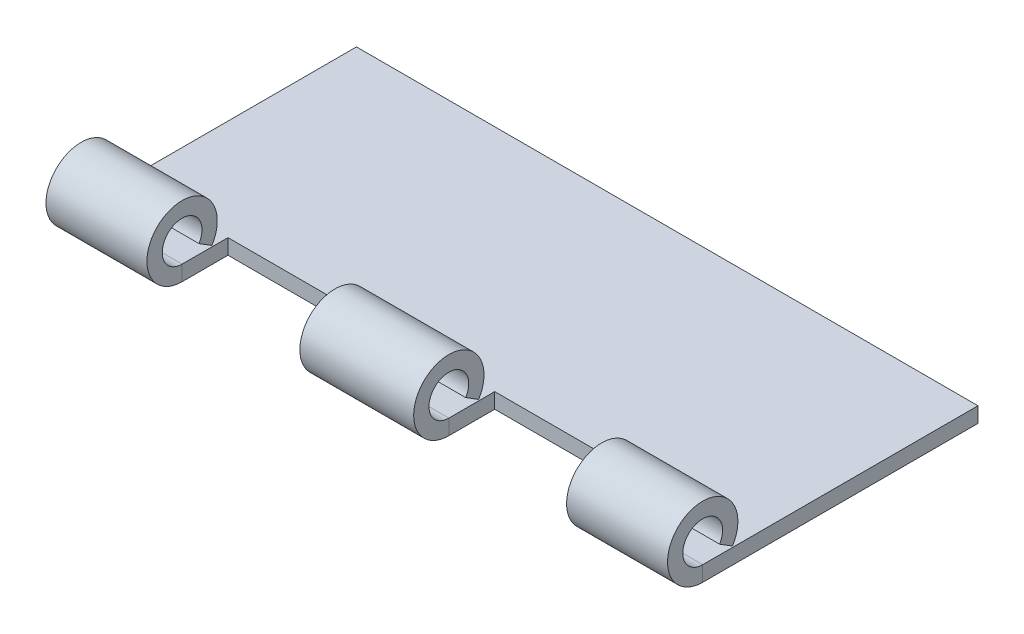
ISO-10303-21;
HEADER;
FILE_DESCRIPTION(('STEP AP214'),'2;1');
FILE_NAME('part.step','',(''),(''),'','','');
FILE_SCHEMA(('AUTOMOTIVE_DESIGN { 1 0 10303 214 1 1 1 1 }'));
ENDSEC;
DATA;
#1=APPLICATION_CONTEXT('core data for automotive mechanical design processes');
#2=APPLICATION_PROTOCOL_DEFINITION('international standard','automotive_design',2000,#1);
#3=PRODUCT_CONTEXT('',#1,'mechanical');
#4=PRODUCT('Part','Part','',(#3));
#5=PRODUCT_RELATED_PRODUCT_CATEGORY('part','',(#4));
#6=PRODUCT_DEFINITION_FORMATION('','',#4);
#7=PRODUCT_DEFINITION_CONTEXT('part definition',#1,'design');
#8=PRODUCT_DEFINITION('design','',#6,#7);
#9=PRODUCT_DEFINITION_SHAPE('','',#8);
#10=(LENGTH_UNIT() NAMED_UNIT(*) SI_UNIT(.MILLI.,.METRE.));
#11=(NAMED_UNIT(*) PLANE_ANGLE_UNIT() SI_UNIT($,.RADIAN.));
#12=(NAMED_UNIT(*) SI_UNIT($,.STERADIAN.) SOLID_ANGLE_UNIT());
#13=UNCERTAINTY_MEASURE_WITH_UNIT(LENGTH_MEASURE(1.E-05),#10,'distance_accuracy_value','');
#14=(GEOMETRIC_REPRESENTATION_CONTEXT(3) GLOBAL_UNCERTAINTY_ASSIGNED_CONTEXT((#13)) GLOBAL_UNIT_ASSIGNED_CONTEXT((#10,
#11,#12)) REPRESENTATION_CONTEXT('',''));
#15=CARTESIAN_POINT('',(0.,0.,0.));
#16=DIRECTION('',(0.,0.,1.));
#17=DIRECTION('',(1.,0.,0.));
#18=AXIS2_PLACEMENT_3D('',#15,#16,#17);
#19=CARTESIAN_POINT('',(9.3,-5.75,51.2750552451707));
#20=DIRECTION('',(-1.,0.,0.));
#21=DIRECTION('',(0.,0.,1.));
#22=AXIS2_PLACEMENT_3D('',#19,#20,#21);
#23=PLANE('',#22);
#24=DIRECTION('',(0.,0.,1.));
#25=VECTOR('',#24,1.);
#26=CARTESIAN_POINT('',(9.29999999999997,-3.24999999999999,-45.));
#27=LINE('',#26,#25);
#28=CARTESIAN_POINT('',(9.29999999999998,-3.25,-7.5));
#29=VERTEX_POINT('',#28);
#30=CARTESIAN_POINT('',(9.29999999999998,-3.25,0.));
#31=VERTEX_POINT('',#30);
#32=EDGE_CURVE('E377',#29,#31,#27,.T.);
#33=ORIENTED_EDGE('',*,*,#32,.T.);
#34=DIRECTION('',(0.,-1.,0.));
#35=VECTOR('',#34,1.);
#36=CARTESIAN_POINT('',(9.29999999999998,-3.25,0.));
#37=LINE('',#36,#35);
#38=CARTESIAN_POINT('',(9.29999999999998,-5.75,0.));
#39=VERTEX_POINT('',#38);
#40=EDGE_CURVE('E12',#31,#39,#37,.T.);
#41=ORIENTED_EDGE('',*,*,#40,.T.);
#42=DIRECTION('',(0.,0.,1.));
#43=VECTOR('',#42,1.);
#44=CARTESIAN_POINT('',(9.3,-5.75,51.2750552451707));
#45=LINE('',#44,#43);
#46=CARTESIAN_POINT('',(9.29999999999998,-5.75,-7.5));
#47=VERTEX_POINT('',#46);
#48=EDGE_CURVE('E361',#47,#39,#45,.T.);
#49=ORIENTED_EDGE('',*,*,#48,.F.);
#50=DIRECTION('',(0.,1.,0.));
#51=VECTOR('',#50,1.);
#52=CARTESIAN_POINT('',(9.29999999999998,-5.75,-7.5));
#53=LINE('',#52,#51);
#54=EDGE_CURVE('E360',#47,#29,#53,.T.);
#55=ORIENTED_EDGE('',*,*,#54,.T.);
#56=EDGE_LOOP('',(#33,#41,#49,#55));
#57=FACE_BOUND('',#56,.T.);
#58=ADVANCED_FACE('F42',(#57),#23,.F.);
#59=CARTESIAN_POINT('',(34.3,-5.75,51.2750552451707));
#60=DIRECTION('',(1.,0.,0.));
#61=DIRECTION('',(0.,0.,-1.));
#62=AXIS2_PLACEMENT_3D('',#59,#60,#61);
#63=PLANE('',#62);
#64=DIRECTION('',(0.,0.,-1.));
#65=VECTOR('',#64,1.);
#66=CARTESIAN_POINT('',(34.3,-5.75,51.2750552451707));
#67=LINE('',#66,#65);
#68=CARTESIAN_POINT('',(34.3,-5.75,0.));
#69=VERTEX_POINT('',#68);
#70=CARTESIAN_POINT('',(34.3,-5.75,-7.50000000000001));
#71=VERTEX_POINT('',#70);
#72=EDGE_CURVE('E211',#69,#71,#67,.T.);
#73=ORIENTED_EDGE('',*,*,#72,.F.);
#74=DIRECTION('',(0.,1.,0.));
#75=VECTOR('',#74,1.);
#76=CARTESIAN_POINT('',(34.3,-5.75,0.));
#77=LINE('',#76,#75);
#78=CARTESIAN_POINT('',(34.3,-3.25,0.));
#79=VERTEX_POINT('',#78);
#80=EDGE_CURVE('E51',#69,#79,#77,.T.);
#81=ORIENTED_EDGE('',*,*,#80,.T.);
#82=DIRECTION('',(0.,0.,-1.));
#83=VECTOR('',#82,1.);
#84=CARTESIAN_POINT('',(34.3,-3.24999999999999,-45.));
#85=LINE('',#84,#83);
#86=CARTESIAN_POINT('',(34.3,-3.25,-7.50000000000001));
#87=VERTEX_POINT('',#86);
#88=EDGE_CURVE('E207',#79,#87,#85,.T.);
#89=ORIENTED_EDGE('',*,*,#88,.T.);
#90=DIRECTION('',(0.,1.,0.));
#91=VECTOR('',#90,1.);
#92=CARTESIAN_POINT('',(34.3,-5.75,-7.50000000000001));
#93=LINE('',#92,#91);
#94=EDGE_CURVE('E357',#71,#87,#93,.T.);
#95=ORIENTED_EDGE('',*,*,#94,.F.);
#96=EDGE_LOOP('',(#73,#81,#89,#95));
#97=FACE_BOUND('',#96,.T.);
#98=ADVANCED_FACE('F203',(#97),#63,.F.);
#99=CARTESIAN_POINT('',(-34.3,-5.75,51.2750552451707));
#100=DIRECTION('',(-1.,0.,0.));
#101=DIRECTION('',(0.,0.,1.));
#102=AXIS2_PLACEMENT_3D('',#99,#100,#101);
#103=PLANE('',#102);
#104=DIRECTION('',(0.,0.,1.));
#105=VECTOR('',#104,1.);
#106=CARTESIAN_POINT('',(-34.3,-3.24999999999999,-45.));
#107=LINE('',#106,#105);
#108=CARTESIAN_POINT('',(-34.3,-3.25,-7.5));
#109=VERTEX_POINT('',#108);
#110=CARTESIAN_POINT('',(-34.3,-3.25,0.));
#111=VERTEX_POINT('',#110);
#112=EDGE_CURVE('E248',#109,#111,#107,.T.);
#113=ORIENTED_EDGE('',*,*,#112,.T.);
#114=DIRECTION('',(0.,-1.,0.));
#115=VECTOR('',#114,1.);
#116=CARTESIAN_POINT('',(-34.3,-3.25,0.));
#117=LINE('',#116,#115);
#118=CARTESIAN_POINT('',(-34.3,-5.75,0.));
#119=VERTEX_POINT('',#118);
#120=EDGE_CURVE('E195',#111,#119,#117,.T.);
#121=ORIENTED_EDGE('',*,*,#120,.T.);
#122=DIRECTION('',(0.,0.,1.));
#123=VECTOR('',#122,1.);
#124=CARTESIAN_POINT('',(-34.3,-5.75,51.2750552451707));
#125=LINE('',#124,#123);
#126=CARTESIAN_POINT('',(-34.3,-5.75,-7.5));
#127=VERTEX_POINT('',#126);
#128=EDGE_CURVE('E234',#127,#119,#125,.T.);
#129=ORIENTED_EDGE('',*,*,#128,.F.);
#130=DIRECTION('',(0.,1.,0.));
#131=VECTOR('',#130,1.);
#132=CARTESIAN_POINT('',(-34.3,-5.75,-7.5));
#133=LINE('',#132,#131);
#134=EDGE_CURVE('E237',#127,#109,#133,.T.);
#135=ORIENTED_EDGE('',*,*,#134,.T.);
#136=EDGE_LOOP('',(#113,#121,#129,#135));
#137=FACE_BOUND('',#136,.T.);
#138=ADVANCED_FACE('F410',(#137),#103,.F.);
#139=CARTESIAN_POINT('',(-9.29999999999998,-5.75,51.2750552451707));
#140=DIRECTION('',(1.,0.,0.));
#141=DIRECTION('',(0.,0.,-1.));
#142=AXIS2_PLACEMENT_3D('',#139,#140,#141);
#143=PLANE('',#142);
#144=DIRECTION('',(0.,0.,-1.));
#145=VECTOR('',#144,1.);
#146=CARTESIAN_POINT('',(-9.29999999999998,-5.75,51.2750552451707));
#147=LINE('',#146,#145);
#148=CARTESIAN_POINT('',(-9.29999999999998,-5.75,0.));
#149=VERTEX_POINT('',#148);
#150=CARTESIAN_POINT('',(-9.29999999999998,-5.75,-7.5));
#151=VERTEX_POINT('',#150);
#152=EDGE_CURVE('E225',#149,#151,#147,.T.);
#153=ORIENTED_EDGE('',*,*,#152,.F.);
#154=DIRECTION('',(0.,1.,0.));
#155=VECTOR('',#154,1.);
#156=CARTESIAN_POINT('',(-9.29999999999998,-5.75,0.));
#157=LINE('',#156,#155);
#158=CARTESIAN_POINT('',(-9.29999999999998,-3.25,0.));
#159=VERTEX_POINT('',#158);
#160=EDGE_CURVE('E192',#149,#159,#157,.T.);
#161=ORIENTED_EDGE('',*,*,#160,.T.);
#162=DIRECTION('',(0.,0.,-1.));
#163=VECTOR('',#162,1.);
#164=CARTESIAN_POINT('',(-9.29999999999998,-3.24999999999999,-45.));
#165=LINE('',#164,#163);
#166=CARTESIAN_POINT('',(-9.29999999999998,-3.25,-7.5));
#167=VERTEX_POINT('',#166);
#168=EDGE_CURVE('E144',#159,#167,#165,.T.);
#169=ORIENTED_EDGE('',*,*,#168,.T.);
#170=DIRECTION('',(0.,1.,0.));
#171=VECTOR('',#170,1.);
#172=CARTESIAN_POINT('',(-9.29999999999998,-5.75,-7.5));
#173=LINE('',#172,#171);
#174=EDGE_CURVE('E236',#151,#167,#173,.T.);
#175=ORIENTED_EDGE('',*,*,#174,.F.);
#176=EDGE_LOOP('',(#153,#161,#169,#175));
#177=FACE_BOUND('',#176,.T.);
#178=ADVANCED_FACE('F306',(#177),#143,.F.);
#179=CARTESIAN_POINT('',(50.8,0.,0.));
#180=DIRECTION('',(-1.,0.,0.));
#181=DIRECTION('',(0.,0.,1.));
#182=AXIS2_PLACEMENT_3D('',#179,#180,#181);
#183=CYLINDRICAL_SURFACE('',#182,3.25);
#184=CARTESIAN_POINT('',(34.3,0.,0.));
#185=DIRECTION('',(1.,0.,0.));
#186=DIRECTION('',(0.,0.,-1.));
#187=AXIS2_PLACEMENT_3D('',#184,#185,#186);
#188=CIRCLE('',#187,3.25);
#189=CARTESIAN_POINT('',(34.3,-1.72391304347826,-2.7551086763548));
#190=VERTEX_POINT('',#189);
#191=EDGE_CURVE('E118',#190,#79,#188,.T.);
#192=ORIENTED_EDGE('',*,*,#191,.F.);
#193=DIRECTION('',(-1.,0.,0.));
#194=VECTOR('',#193,1.);
#195=CARTESIAN_POINT('',(50.8,-1.72391304347826,-2.7551086763548));
#196=LINE('',#195,#194);
#197=CARTESIAN_POINT('',(50.8,-1.72391304347826,-2.7551086763548));
#198=VERTEX_POINT('',#197);
#199=EDGE_CURVE('E111',#198,#190,#196,.T.);
#200=ORIENTED_EDGE('',*,*,#199,.F.);
#201=CARTESIAN_POINT('',(50.8,0.,0.));
#202=DIRECTION('',(1.,0.,0.));
#203=DIRECTION('',(0.,0.,-1.));
#204=AXIS2_PLACEMENT_3D('',#201,#202,#203);
#205=CIRCLE('',#204,3.25);
#206=CARTESIAN_POINT('',(50.8,-3.25,0.));
#207=VERTEX_POINT('',#206);
#208=EDGE_CURVE('E115',#198,#207,#205,.T.);
#209=ORIENTED_EDGE('',*,*,#208,.T.);
#210=DIRECTION('',(-1.,0.,0.));
#211=VECTOR('',#210,1.);
#212=CARTESIAN_POINT('',(50.8,-3.25,0.));
#213=LINE('',#212,#211);
#214=EDGE_CURVE('E164',#207,#79,#213,.T.);
#215=ORIENTED_EDGE('',*,*,#214,.T.);
#216=EDGE_LOOP('',(#192,#200,#209,#215));
#217=FACE_BOUND('',#216,.T.);
#218=ADVANCED_FACE('F113',(#217),#183,.F.);
#219=CARTESIAN_POINT('',(50.8,-3.05,-4.87442304278158));
#220=DIRECTION('',(0.,-0.847725746570709,0.530434782608696));
#221=DIRECTION('',(0.,-0.530434782608696,-0.847725746570709));
#222=AXIS2_PLACEMENT_3D('',#219,#220,#221);
#223=PLANE('',#222);
#224=DIRECTION('',(0.,0.530434782608696,0.847725746570709));
#225=VECTOR('',#224,1.);
#226=CARTESIAN_POINT('',(34.3,-3.05,-4.87442304278158));
#227=LINE('',#226,#225);
#228=CARTESIAN_POINT('',(34.3,-3.05,-4.87442304278158));
#229=VERTEX_POINT('',#228);
#230=EDGE_CURVE('E218',#229,#190,#227,.T.);
#231=ORIENTED_EDGE('',*,*,#230,.F.);
#232=DIRECTION('',(-1.,0.,0.));
#233=VECTOR('',#232,1.);
#234=CARTESIAN_POINT('',(50.8,-3.05,-4.87442304278158));
#235=LINE('',#234,#233);
#236=CARTESIAN_POINT('',(50.8,-3.05,-4.87442304278158));
#237=VERTEX_POINT('',#236);
#238=EDGE_CURVE('E134',#237,#229,#235,.T.);
#239=ORIENTED_EDGE('',*,*,#238,.F.);
#240=DIRECTION('',(0.,0.530434782608696,0.847725746570709));
#241=VECTOR('',#240,1.);
#242=CARTESIAN_POINT('',(50.8,-3.05,-4.87442304278158));
#243=LINE('',#242,#241);
#244=EDGE_CURVE('E128',#237,#198,#243,.T.);
#245=ORIENTED_EDGE('',*,*,#244,.T.);
#246=ORIENTED_EDGE('',*,*,#199,.T.);
#247=EDGE_LOOP('',(#231,#239,#245,#246));
#248=FACE_BOUND('',#247,.T.);
#249=ADVANCED_FACE('F132',(#248),#223,.T.);
#250=CARTESIAN_POINT('',(50.8,0.,0.));
#251=DIRECTION('',(-1.,0.,0.));
#252=DIRECTION('',(0.,0.,1.));
#253=AXIS2_PLACEMENT_3D('',#250,#251,#252);
#254=CYLINDRICAL_SURFACE('',#253,5.75);
#255=DIRECTION('',(-1.,0.,0.));
#256=VECTOR('',#255,1.);
#257=CARTESIAN_POINT('',(50.8,-5.75,0.));
#258=LINE('',#257,#256);
#259=EDGE_CURVE('E161',#39,#149,#258,.T.);
#260=ORIENTED_EDGE('',*,*,#259,.F.);
#261=CARTESIAN_POINT('',(9.29999999999998,0.,0.));
#262=DIRECTION('',(-1.,0.,0.));
#263=DIRECTION('',(0.,0.,1.));
#264=AXIS2_PLACEMENT_3D('',#261,#262,#263);
#265=CIRCLE('',#264,5.75);
#266=CARTESIAN_POINT('',(9.29999999999998,-3.05,-4.87442304278158));
#267=VERTEX_POINT('',#266);
#268=EDGE_CURVE('E183',#39,#267,#265,.T.);
#269=ORIENTED_EDGE('',*,*,#268,.T.);
#270=CARTESIAN_POINT('',(-9.29999999999998,-3.05,-4.87442304278158));
#271=VERTEX_POINT('',#270);
#272=EDGE_CURVE('E162',#267,#271,#235,.T.);
#273=ORIENTED_EDGE('',*,*,#272,.T.);
#274=CARTESIAN_POINT('',(-9.29999999999998,0.,0.));
#275=DIRECTION('',(1.,0.,0.));
#276=DIRECTION('',(0.,0.,-1.));
#277=AXIS2_PLACEMENT_3D('',#274,#275,#276);
#278=CIRCLE('',#277,5.75);
#279=EDGE_CURVE('E177',#271,#149,#278,.T.);
#280=ORIENTED_EDGE('',*,*,#279,.T.);
#281=EDGE_LOOP('',(#260,#269,#273,#280));
#282=FACE_BOUND('',#281,.T.);
#283=ADVANCED_FACE('F324',(#282),#254,.T.);
#284=CARTESIAN_POINT('',(9.29999999999998,0.,0.));
#285=DIRECTION('',(-1.,0.,0.));
#286=DIRECTION('',(0.,0.,1.));
#287=AXIS2_PLACEMENT_3D('',#284,#285,#286);
#288=CIRCLE('',#287,3.25);
#289=CARTESIAN_POINT('',(9.29999999999998,-1.72391304347826,-2.7551086763548));
#290=VERTEX_POINT('',#289);
#291=EDGE_CURVE('E292',#31,#290,#288,.T.);
#292=ORIENTED_EDGE('',*,*,#291,.F.);
#293=EDGE_CURVE('E167',#31,#159,#213,.T.);
#294=ORIENTED_EDGE('',*,*,#293,.T.);
#295=CARTESIAN_POINT('',(-9.29999999999998,0.,0.));
#296=DIRECTION('',(1.,0.,0.));
#297=DIRECTION('',(0.,0.,-1.));
#298=AXIS2_PLACEMENT_3D('',#295,#296,#297);
#299=CIRCLE('',#298,3.25);
#300=CARTESIAN_POINT('',(-9.29999999999998,-1.72391304347826,-2.7551086763548));
#301=VERTEX_POINT('',#300);
#302=EDGE_CURVE('E254',#301,#159,#299,.T.);
#303=ORIENTED_EDGE('',*,*,#302,.F.);
#304=EDGE_CURVE('E123',#290,#301,#196,.T.);
#305=ORIENTED_EDGE('',*,*,#304,.F.);
#306=EDGE_LOOP('',(#292,#294,#303,#305));
#307=FACE_BOUND('',#306,.T.);
#308=ADVANCED_FACE('F287',(#307),#183,.F.);
#309=DIRECTION('',(0.,-0.530434782608696,-0.847725746570709));
#310=VECTOR('',#309,1.);
#311=CARTESIAN_POINT('',(9.29999999999998,-3.04999999999999,-4.87442304278157));
#312=LINE('',#311,#310);
#313=EDGE_CURVE('E373',#290,#267,#312,.T.);
#314=ORIENTED_EDGE('',*,*,#313,.F.);
#315=ORIENTED_EDGE('',*,*,#304,.T.);
#316=DIRECTION('',(0.,0.530434782608696,0.847725746570709));
#317=VECTOR('',#316,1.);
#318=CARTESIAN_POINT('',(-9.29999999999998,-3.05,-4.87442304278158));
#319=LINE('',#318,#317);
#320=EDGE_CURVE('E251',#271,#301,#319,.T.);
#321=ORIENTED_EDGE('',*,*,#320,.F.);
#322=ORIENTED_EDGE('',*,*,#272,.F.);
#323=EDGE_LOOP('',(#314,#315,#321,#322));
#324=FACE_BOUND('',#323,.T.);
#325=ADVANCED_FACE('F385',(#324),#223,.T.);
#326=CARTESIAN_POINT('',(-50.8,-5.75,0.));
#327=VERTEX_POINT('',#326);
#328=EDGE_CURVE('E92',#119,#327,#258,.T.);
#329=ORIENTED_EDGE('',*,*,#328,.F.);
#330=CARTESIAN_POINT('',(-34.3,0.,0.));
#331=DIRECTION('',(-1.,0.,0.));
#332=DIRECTION('',(0.,0.,1.));
#333=AXIS2_PLACEMENT_3D('',#330,#331,#332);
#334=CIRCLE('',#333,5.75);
#335=CARTESIAN_POINT('',(-34.3,-3.05,-4.87442304278158));
#336=VERTEX_POINT('',#335);
#337=EDGE_CURVE('E175',#119,#336,#334,.T.);
#338=ORIENTED_EDGE('',*,*,#337,.T.);
#339=CARTESIAN_POINT('',(-50.8,-3.05,-4.87442304278158));
#340=VERTEX_POINT('',#339);
#341=EDGE_CURVE('E84',#336,#340,#235,.T.);
#342=ORIENTED_EDGE('',*,*,#341,.T.);
#343=CARTESIAN_POINT('',(-50.8,0.,0.));
#344=DIRECTION('',(1.,0.,0.));
#345=DIRECTION('',(0.,0.,-1.));
#346=AXIS2_PLACEMENT_3D('',#343,#344,#345);
#347=CIRCLE('',#346,5.75);
#348=EDGE_CURVE('E156',#340,#327,#347,.T.);
#349=ORIENTED_EDGE('',*,*,#348,.T.);
#350=EDGE_LOOP('',(#329,#338,#342,#349));
#351=FACE_BOUND('',#350,.T.);
#352=ADVANCED_FACE('F392',(#351),#254,.T.);
#353=CARTESIAN_POINT('',(50.8,-3.25,0.));
#354=DIRECTION('',(1.,0.,0.));
#355=DIRECTION('',(0.,0.,-1.));
#356=AXIS2_PLACEMENT_3D('',#353,#354,#355);
#357=PLANE('',#356);
#358=DIRECTION('',(0.,-1.,0.));
#359=VECTOR('',#358,1.);
#360=CARTESIAN_POINT('',(50.8,-3.25,0.));
#361=LINE('',#360,#359);
#362=CARTESIAN_POINT('',(50.8,-5.75,0.));
#363=VERTEX_POINT('',#362);
#364=EDGE_CURVE('E59',#207,#363,#361,.T.);
#365=ORIENTED_EDGE('',*,*,#364,.F.);
#366=ORIENTED_EDGE('',*,*,#208,.F.);
#367=ORIENTED_EDGE('',*,*,#244,.F.);
#368=CARTESIAN_POINT('',(50.8,0.,0.));
#369=DIRECTION('',(1.,0.,0.));
#370=DIRECTION('',(0.,0.,-1.));
#371=AXIS2_PLACEMENT_3D('',#368,#369,#370);
#372=CIRCLE('',#371,5.75);
#373=EDGE_CURVE('E136',#237,#363,#372,.T.);
#374=ORIENTED_EDGE('',*,*,#373,.T.);
#375=EDGE_LOOP('',(#365,#366,#367,#374));
#376=FACE_BOUND('',#375,.T.);
#377=ADVANCED_FACE('F44',(#376),#357,.T.);
#378=CARTESIAN_POINT('',(-50.8,-5.75,0.));
#379=DIRECTION('',(-1.,0.,0.));
#380=DIRECTION('',(0.,0.,1.));
#381=AXIS2_PLACEMENT_3D('',#378,#379,#380);
#382=PLANE('',#381);
#383=DIRECTION('',(0.,1.,0.));
#384=VECTOR('',#383,1.);
#385=CARTESIAN_POINT('',(-50.8,-5.75,0.));
#386=LINE('',#385,#384);
#387=CARTESIAN_POINT('',(-50.8,-3.25,0.));
#388=VERTEX_POINT('',#387);
#389=EDGE_CURVE('E171',#327,#388,#386,.T.);
#390=ORIENTED_EDGE('',*,*,#389,.F.);
#391=ORIENTED_EDGE('',*,*,#348,.F.);
#392=DIRECTION('',(0.,0.530434782608696,0.847725746570709));
#393=VECTOR('',#392,1.);
#394=CARTESIAN_POINT('',(-50.8,-3.05,-4.87442304278158));
#395=LINE('',#394,#393);
#396=CARTESIAN_POINT('',(-50.8,-1.72391304347826,-2.7551086763548));
#397=VERTEX_POINT('',#396);
#398=EDGE_CURVE('E153',#340,#397,#395,.T.);
#399=ORIENTED_EDGE('',*,*,#398,.T.);
#400=CARTESIAN_POINT('',(-50.8,0.,0.));
#401=DIRECTION('',(1.,0.,0.));
#402=DIRECTION('',(0.,0.,-1.));
#403=AXIS2_PLACEMENT_3D('',#400,#401,#402);
#404=CIRCLE('',#403,3.25);
#405=EDGE_CURVE('E150',#397,#388,#404,.T.);
#406=ORIENTED_EDGE('',*,*,#405,.T.);
#407=EDGE_LOOP('',(#390,#391,#399,#406));
#408=FACE_BOUND('',#407,.T.);
#409=ADVANCED_FACE('F275',(#408),#382,.T.);
#410=CARTESIAN_POINT('',(50.8,-5.74999999999999,-45.));
#411=DIRECTION('',(0.,1.,0.));
#412=DIRECTION('',(0.,0.,1.));
#413=AXIS2_PLACEMENT_3D('',#410,#411,#412);
#414=PLANE('',#413);
#415=EDGE_CURVE('E158',#363,#69,#258,.T.);
#416=ORIENTED_EDGE('',*,*,#415,.T.);
#417=ORIENTED_EDGE('',*,*,#72,.T.);
#418=DIRECTION('',(-1.,0.,0.));
#419=VECTOR('',#418,1.);
#420=CARTESIAN_POINT('',(34.3,-5.75,-7.50000000000001));
#421=LINE('',#420,#419);
#422=EDGE_CURVE('E364',#71,#47,#421,.T.);
#423=ORIENTED_EDGE('',*,*,#422,.T.);
#424=ORIENTED_EDGE('',*,*,#48,.T.);
#425=ORIENTED_EDGE('',*,*,#259,.T.);
#426=ORIENTED_EDGE('',*,*,#152,.T.);
#427=DIRECTION('',(-1.,0.,0.));
#428=VECTOR('',#427,1.);
#429=CARTESIAN_POINT('',(-34.3,-5.75,-7.5));
#430=LINE('',#429,#428);
#431=EDGE_CURVE('E228',#151,#127,#430,.T.);
#432=ORIENTED_EDGE('',*,*,#431,.T.);
#433=ORIENTED_EDGE('',*,*,#128,.T.);
#434=ORIENTED_EDGE('',*,*,#328,.T.);
#435=DIRECTION('',(0.,0.,-1.));
#436=VECTOR('',#435,1.);
#437=CARTESIAN_POINT('',(-50.8,-5.74999999999999,-45.));
#438=LINE('',#437,#436);
#439=CARTESIAN_POINT('',(-50.8,-5.74999999999999,-45.));
#440=VERTEX_POINT('',#439);
#441=EDGE_CURVE('E141',#327,#440,#438,.T.);
#442=ORIENTED_EDGE('',*,*,#441,.T.);
#443=DIRECTION('',(-1.,0.,0.));
#444=VECTOR('',#443,1.);
#445=CARTESIAN_POINT('',(50.8,-5.74999999999999,-45.));
#446=LINE('',#445,#444);
#447=CARTESIAN_POINT('',(50.8,-5.74999999999999,-45.));
#448=VERTEX_POINT('',#447);
#449=EDGE_CURVE('E169',#448,#440,#446,.T.);
#450=ORIENTED_EDGE('',*,*,#449,.F.);
#451=DIRECTION('',(0.,0.,-1.));
#452=VECTOR('',#451,1.);
#453=CARTESIAN_POINT('',(50.8,-5.74999999999999,-45.));
#454=LINE('',#453,#452);
#455=EDGE_CURVE('E98',#363,#448,#454,.T.);
#456=ORIENTED_EDGE('',*,*,#455,.F.);
#457=EDGE_LOOP('',(#416,#417,#423,#424,#425,#426,#432,#433,#434,#442,#450,#456));
#458=FACE_BOUND('',#457,.T.);
#459=ADVANCED_FACE('F317',(#458),#414,.F.);
#460=CARTESIAN_POINT('',(50.8,-3.24999999999999,-45.));
#461=DIRECTION('',(0.,0.,-1.));
#462=DIRECTION('',(-1.,0.,0.));
#463=AXIS2_PLACEMENT_3D('',#460,#461,#462);
#464=PLANE('',#463);
#465=DIRECTION('',(0.,-1.,0.));
#466=VECTOR('',#465,1.);
#467=CARTESIAN_POINT('',(-50.8,-3.24999999999999,-45.));
#468=LINE('',#467,#466);
#469=CARTESIAN_POINT('',(-50.8,-3.24999999999999,-45.));
#470=VERTEX_POINT('',#469);
#471=EDGE_CURVE('E143',#470,#440,#468,.T.);
#472=ORIENTED_EDGE('',*,*,#471,.F.);
#473=DIRECTION('',(-1.,0.,0.));
#474=VECTOR('',#473,1.);
#475=CARTESIAN_POINT('',(50.8,-3.24999999999999,-45.));
#476=LINE('',#475,#474);
#477=CARTESIAN_POINT('',(50.8,-3.24999999999999,-45.));
#478=VERTEX_POINT('',#477);
#479=EDGE_CURVE('E166',#478,#470,#476,.T.);
#480=ORIENTED_EDGE('',*,*,#479,.F.);
#481=DIRECTION('',(0.,-1.,0.));
#482=VECTOR('',#481,1.);
#483=CARTESIAN_POINT('',(50.8,-3.24999999999999,-45.));
#484=LINE('',#483,#482);
#485=EDGE_CURVE('E260',#478,#448,#484,.T.);
#486=ORIENTED_EDGE('',*,*,#485,.T.);
#487=ORIENTED_EDGE('',*,*,#449,.T.);
#488=EDGE_LOOP('',(#472,#480,#486,#487));
#489=FACE_BOUND('',#488,.T.);
#490=ADVANCED_FACE('F266',(#489),#464,.T.);
#491=CARTESIAN_POINT('',(50.8,-3.24999999999999,-45.));
#492=DIRECTION('',(0.,1.,0.));
#493=DIRECTION('',(0.,0.,1.));
#494=AXIS2_PLACEMENT_3D('',#491,#492,#493);
#495=PLANE('',#494);
#496=ORIENTED_EDGE('',*,*,#88,.F.);
#497=ORIENTED_EDGE('',*,*,#214,.F.);
#498=DIRECTION('',(0.,0.,-1.));
#499=VECTOR('',#498,1.);
#500=CARTESIAN_POINT('',(50.8,-3.24999999999999,-45.));
#501=LINE('',#500,#499);
#502=EDGE_CURVE('E130',#207,#478,#501,.T.);
#503=ORIENTED_EDGE('',*,*,#502,.T.);
#504=ORIENTED_EDGE('',*,*,#479,.T.);
#505=DIRECTION('',(0.,0.,-1.));
#506=VECTOR('',#505,1.);
#507=CARTESIAN_POINT('',(-50.8,-3.24999999999999,-45.));
#508=LINE('',#507,#506);
#509=EDGE_CURVE('E147',#388,#470,#508,.T.);
#510=ORIENTED_EDGE('',*,*,#509,.F.);
#511=EDGE_CURVE('E122',#111,#388,#213,.T.);
#512=ORIENTED_EDGE('',*,*,#511,.F.);
#513=ORIENTED_EDGE('',*,*,#112,.F.);
#514=DIRECTION('',(-1.,0.,0.));
#515=VECTOR('',#514,1.);
#516=CARTESIAN_POINT('',(50.8,-3.25,-7.5));
#517=LINE('',#516,#515);
#518=EDGE_CURVE('E180',#167,#109,#517,.T.);
#519=ORIENTED_EDGE('',*,*,#518,.F.);
#520=ORIENTED_EDGE('',*,*,#168,.F.);
#521=ORIENTED_EDGE('',*,*,#293,.F.);
#522=ORIENTED_EDGE('',*,*,#32,.F.);
#523=DIRECTION('',(-1.,0.,0.));
#524=VECTOR('',#523,1.);
#525=CARTESIAN_POINT('',(50.8,-3.25,-7.50000000000001));
#526=LINE('',#525,#524);
#527=EDGE_CURVE('E189',#87,#29,#526,.T.);
#528=ORIENTED_EDGE('',*,*,#527,.F.);
#529=EDGE_LOOP('',(#496,#497,#503,#504,#510,#512,#513,#519,#520,#521,#522,#528));
#530=FACE_BOUND('',#529,.T.);
#531=ADVANCED_FACE('F222',(#530),#495,.T.);
#532=CARTESIAN_POINT('',(-34.3,0.,0.));
#533=DIRECTION('',(-1.,0.,0.));
#534=DIRECTION('',(0.,0.,1.));
#535=AXIS2_PLACEMENT_3D('',#532,#533,#534);
#536=CIRCLE('',#535,3.25);
#537=CARTESIAN_POINT('',(-34.3,-1.72391304347826,-2.7551086763548));
#538=VERTEX_POINT('',#537);
#539=EDGE_CURVE('E245',#111,#538,#536,.T.);
#540=ORIENTED_EDGE('',*,*,#539,.F.);
#541=ORIENTED_EDGE('',*,*,#511,.T.);
#542=ORIENTED_EDGE('',*,*,#405,.F.);
#543=EDGE_CURVE('E125',#538,#397,#196,.T.);
#544=ORIENTED_EDGE('',*,*,#543,.F.);
#545=EDGE_LOOP('',(#540,#541,#542,#544));
#546=FACE_BOUND('',#545,.T.);
#547=ADVANCED_FACE('F280',(#546),#183,.F.);
#548=DIRECTION('',(0.,-0.530434782608696,-0.847725746570709));
#549=VECTOR('',#548,1.);
#550=CARTESIAN_POINT('',(-34.3,-3.04999999999998,-4.87442304278155));
#551=LINE('',#550,#549);
#552=EDGE_CURVE('E240',#538,#336,#551,.T.);
#553=ORIENTED_EDGE('',*,*,#552,.F.);
#554=ORIENTED_EDGE('',*,*,#543,.T.);
#555=ORIENTED_EDGE('',*,*,#398,.F.);
#556=ORIENTED_EDGE('',*,*,#341,.F.);
#557=EDGE_LOOP('',(#553,#554,#555,#556));
#558=FACE_BOUND('',#557,.T.);
#559=ADVANCED_FACE('F388',(#558),#223,.T.);
#560=ORIENTED_EDGE('',*,*,#238,.T.);
#561=CARTESIAN_POINT('',(34.3,0.,0.));
#562=DIRECTION('',(1.,0.,0.));
#563=DIRECTION('',(0.,0.,-1.));
#564=AXIS2_PLACEMENT_3D('',#561,#562,#563);
#565=CIRCLE('',#564,5.75);
#566=EDGE_CURVE('E186',#229,#69,#565,.T.);
#567=ORIENTED_EDGE('',*,*,#566,.T.);
#568=ORIENTED_EDGE('',*,*,#415,.F.);
#569=ORIENTED_EDGE('',*,*,#373,.F.);
#570=EDGE_LOOP('',(#560,#567,#568,#569));
#571=FACE_BOUND('',#570,.T.);
#572=ADVANCED_FACE('F395',(#571),#254,.T.);
#573=CARTESIAN_POINT('',(50.8,0.,0.));
#574=DIRECTION('',(1.,0.,0.));
#575=DIRECTION('',(0.,0.,-1.));
#576=AXIS2_PLACEMENT_3D('',#573,#574,#575);
#577=PLANE('',#576);
#578=ORIENTED_EDGE('',*,*,#455,.T.);
#579=ORIENTED_EDGE('',*,*,#485,.F.);
#580=ORIENTED_EDGE('',*,*,#502,.F.);
#581=ORIENTED_EDGE('',*,*,#364,.T.);
#582=EDGE_LOOP('',(#578,#579,#580,#581));
#583=FACE_BOUND('',#582,.T.);
#584=ADVANCED_FACE('F264',(#583),#577,.T.);
#585=CARTESIAN_POINT('',(-50.8,0.,0.));
#586=DIRECTION('',(1.,0.,0.));
#587=DIRECTION('',(0.,0.,-1.));
#588=AXIS2_PLACEMENT_3D('',#585,#586,#587);
#589=PLANE('',#588);
#590=ORIENTED_EDGE('',*,*,#441,.F.);
#591=ORIENTED_EDGE('',*,*,#389,.T.);
#592=ORIENTED_EDGE('',*,*,#509,.T.);
#593=ORIENTED_EDGE('',*,*,#471,.T.);
#594=EDGE_LOOP('',(#590,#591,#592,#593));
#595=FACE_BOUND('',#594,.T.);
#596=ADVANCED_FACE('F269',(#595),#589,.F.);
#597=ORIENTED_EDGE('',*,*,#160,.F.);
#598=ORIENTED_EDGE('',*,*,#279,.F.);
#599=ORIENTED_EDGE('',*,*,#320,.T.);
#600=ORIENTED_EDGE('',*,*,#302,.T.);
#601=EDGE_LOOP('',(#597,#598,#599,#600));
#602=FACE_BOUND('',#601,.T.);
#603=ADVANCED_FACE('F296',(#602),#143,.F.);
#604=ORIENTED_EDGE('',*,*,#120,.F.);
#605=ORIENTED_EDGE('',*,*,#539,.T.);
#606=ORIENTED_EDGE('',*,*,#552,.T.);
#607=ORIENTED_EDGE('',*,*,#337,.F.);
#608=EDGE_LOOP('',(#604,#605,#606,#607));
#609=FACE_BOUND('',#608,.T.);
#610=ADVANCED_FACE('F391',(#609),#103,.F.);
#611=CARTESIAN_POINT('',(-34.3,-5.75,-7.5));
#612=DIRECTION('',(0.,0.,-1.));
#613=DIRECTION('',(-1.,0.,0.));
#614=AXIS2_PLACEMENT_3D('',#611,#612,#613);
#615=PLANE('',#614);
#616=ORIENTED_EDGE('',*,*,#518,.T.);
#617=ORIENTED_EDGE('',*,*,#134,.F.);
#618=ORIENTED_EDGE('',*,*,#431,.F.);
#619=ORIENTED_EDGE('',*,*,#174,.T.);
#620=EDGE_LOOP('',(#616,#617,#618,#619));
#621=FACE_BOUND('',#620,.T.);
#622=ADVANCED_FACE('F311',(#621),#615,.F.);
#623=ORIENTED_EDGE('',*,*,#80,.F.);
#624=ORIENTED_EDGE('',*,*,#566,.F.);
#625=ORIENTED_EDGE('',*,*,#230,.T.);
#626=ORIENTED_EDGE('',*,*,#191,.T.);
#627=EDGE_LOOP('',(#623,#624,#625,#626));
#628=FACE_BOUND('',#627,.T.);
#629=ADVANCED_FACE('F217',(#628),#63,.F.);
#630=ORIENTED_EDGE('',*,*,#40,.F.);
#631=ORIENTED_EDGE('',*,*,#291,.T.);
#632=ORIENTED_EDGE('',*,*,#313,.T.);
#633=ORIENTED_EDGE('',*,*,#268,.F.);
#634=EDGE_LOOP('',(#630,#631,#632,#633));
#635=FACE_BOUND('',#634,.T.);
#636=ADVANCED_FACE('F382',(#635),#23,.F.);
#637=CARTESIAN_POINT('',(34.3,-5.75,-7.50000000000001));
#638=DIRECTION('',(0.,0.,-1.));
#639=DIRECTION('',(-1.,0.,0.));
#640=AXIS2_PLACEMENT_3D('',#637,#638,#639);
#641=PLANE('',#640);
#642=ORIENTED_EDGE('',*,*,#527,.T.);
#643=ORIENTED_EDGE('',*,*,#54,.F.);
#644=ORIENTED_EDGE('',*,*,#422,.F.);
#645=ORIENTED_EDGE('',*,*,#94,.T.);
#646=EDGE_LOOP('',(#642,#643,#644,#645));
#647=FACE_BOUND('',#646,.T.);
#648=ADVANCED_FACE('F365',(#647),#641,.F.);
#649=CLOSED_SHELL('',(#58,#98,#138,#178,#218,#249,#283,#308,#325,#352,#377,#409,#459,#490,#531,
#547,#559,#572,#584,#596,#603,#610,#622,#629,#636,#648));
#650=MANIFOLD_SOLID_BREP('B2',#649);
#651=ADVANCED_BREP_SHAPE_REPRESENTATION('',(#18,#650),#14);
#652=SHAPE_DEFINITION_REPRESENTATION(#9,#651);
ENDSEC;
END-ISO-10303-21;
